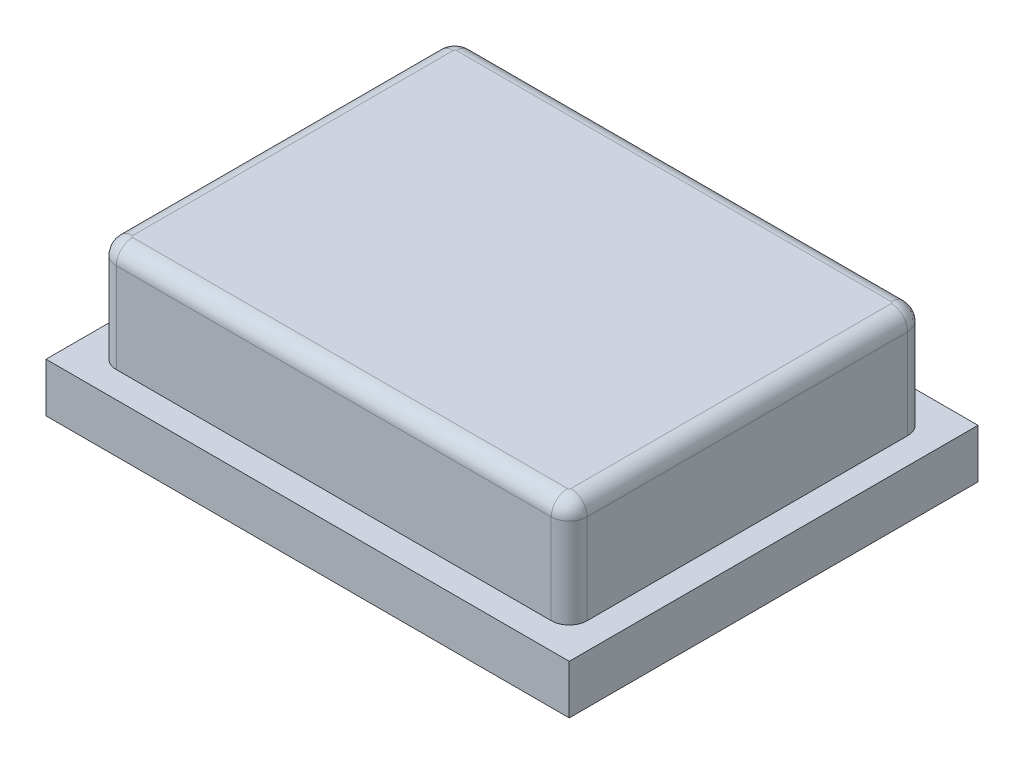
ISO-10303-21;
HEADER;
FILE_DESCRIPTION(('STEP AP214'),'2;1');
FILE_NAME('part.step','',(''),(''),'','','');
FILE_SCHEMA(('AUTOMOTIVE_DESIGN { 1 0 10303 214 1 1 1 1 }'));
ENDSEC;
DATA;
#1=APPLICATION_CONTEXT('core data for automotive mechanical design processes');
#2=APPLICATION_PROTOCOL_DEFINITION('international standard','automotive_design',2000,#1);
#3=PRODUCT_CONTEXT('',#1,'mechanical');
#4=PRODUCT('Part','Part','',(#3));
#5=PRODUCT_RELATED_PRODUCT_CATEGORY('part','',(#4));
#6=PRODUCT_DEFINITION_FORMATION('','',#4);
#7=PRODUCT_DEFINITION_CONTEXT('part definition',#1,'design');
#8=PRODUCT_DEFINITION('design','',#6,#7);
#9=PRODUCT_DEFINITION_SHAPE('','',#8);
#10=(LENGTH_UNIT() NAMED_UNIT(*) SI_UNIT(.MILLI.,.METRE.));
#11=(NAMED_UNIT(*) PLANE_ANGLE_UNIT() SI_UNIT($,.RADIAN.));
#12=(NAMED_UNIT(*) SI_UNIT($,.STERADIAN.) SOLID_ANGLE_UNIT());
#13=UNCERTAINTY_MEASURE_WITH_UNIT(LENGTH_MEASURE(1.E-05),#10,'distance_accuracy_value','');
#14=(GEOMETRIC_REPRESENTATION_CONTEXT(3) GLOBAL_UNCERTAINTY_ASSIGNED_CONTEXT((#13)) GLOBAL_UNIT_ASSIGNED_CONTEXT((#10,
#11,#12)) REPRESENTATION_CONTEXT('',''));
#15=CARTESIAN_POINT('',(0.,0.,0.));
#16=DIRECTION('',(0.,0.,1.));
#17=DIRECTION('',(1.,0.,0.));
#18=AXIS2_PLACEMENT_3D('',#15,#16,#17);
#19=CARTESIAN_POINT('',(-0.95,0.,0.));
#20=DIRECTION('',(0.,-1.,0.));
#21=DIRECTION('',(0.,0.,-1.));
#22=AXIS2_PLACEMENT_3D('',#19,#20,#21);
#23=PLANE('',#22);
#24=DIRECTION('',(0.,0.,-1.));
#25=VECTOR('',#24,1.);
#26=CARTESIAN_POINT('',(-1.55,0.,1.15));
#27=LINE('',#26,#25);
#28=CARTESIAN_POINT('',(-1.55,0.,1.15));
#29=VERTEX_POINT('',#28);
#30=CARTESIAN_POINT('',(-1.55,0.,-1.15));
#31=VERTEX_POINT('',#30);
#32=EDGE_CURVE('P0_E55',#29,#31,#27,.T.);
#33=ORIENTED_EDGE('',*,*,#32,.T.);
#34=DIRECTION('',(1.,0.,0.));
#35=VECTOR('',#34,1.);
#36=CARTESIAN_POINT('',(-1.55,0.,-1.15));
#37=LINE('',#36,#35);
#38=CARTESIAN_POINT('',(-0.35,0.,-1.15));
#39=VERTEX_POINT('',#38);
#40=EDGE_CURVE('P0_E76',#31,#39,#37,.T.);
#41=ORIENTED_EDGE('',*,*,#40,.T.);
#42=DIRECTION('',(0.,0.,1.));
#43=VECTOR('',#42,1.);
#44=CARTESIAN_POINT('',(-0.35,0.,1.15));
#45=LINE('',#44,#43);
#46=CARTESIAN_POINT('',(-0.35,0.,1.15));
#47=VERTEX_POINT('',#46);
#48=EDGE_CURVE('P0_E58',#39,#47,#45,.T.);
#49=ORIENTED_EDGE('',*,*,#48,.T.);
#50=DIRECTION('',(-1.,0.,0.));
#51=VECTOR('',#50,1.);
#52=CARTESIAN_POINT('',(-1.55,0.,1.15));
#53=LINE('',#52,#51);
#54=EDGE_CURVE('P0_E20',#47,#29,#53,.T.);
#55=ORIENTED_EDGE('',*,*,#54,.T.);
#56=EDGE_LOOP('',(#33,#41,#49,#55));
#57=FACE_BOUND('',#56,.T.);
#58=ADVANCED_FACE('P0_F17',(#57),#23,.T.);
#59=CARTESIAN_POINT('',(-1.55,0.05,1.15));
#60=DIRECTION('',(0.,0.,-1.));
#61=DIRECTION('',(-1.,0.,0.));
#62=AXIS2_PLACEMENT_3D('',#59,#60,#61);
#63=PLANE('',#62);
#64=DIRECTION('',(0.,1.,0.));
#65=VECTOR('',#64,1.);
#66=CARTESIAN_POINT('',(-0.35,0.05,1.15));
#67=LINE('',#66,#65);
#68=CARTESIAN_POINT('',(-0.35,0.05,1.15));
#69=VERTEX_POINT('',#68);
#70=EDGE_CURVE('P0_E78',#47,#69,#67,.T.);
#71=ORIENTED_EDGE('',*,*,#70,.T.);
#72=DIRECTION('',(1.,0.,0.));
#73=VECTOR('',#72,1.);
#74=CARTESIAN_POINT('',(-0.95,0.05,1.15));
#75=LINE('',#74,#73);
#76=CARTESIAN_POINT('',(-1.55,0.05,1.15));
#77=VERTEX_POINT('',#76);
#78=EDGE_CURVE('P0_E73',#69,#77,#75,.F.);
#79=ORIENTED_EDGE('',*,*,#78,.T.);
#80=DIRECTION('',(0.,1.,0.));
#81=VECTOR('',#80,1.);
#82=CARTESIAN_POINT('',(-1.55,0.05,1.15));
#83=LINE('',#82,#81);
#84=EDGE_CURVE('P0_E63',#77,#29,#83,.F.);
#85=ORIENTED_EDGE('',*,*,#84,.T.);
#86=ORIENTED_EDGE('',*,*,#54,.F.);
#87=EDGE_LOOP('',(#71,#79,#85,#86));
#88=FACE_BOUND('',#87,.T.);
#89=ADVANCED_FACE('P0_F72',(#88),#63,.F.);
#90=CARTESIAN_POINT('',(-1.55,0.05,1.15));
#91=DIRECTION('',(1.,0.,0.));
#92=DIRECTION('',(0.,0.,-1.));
#93=AXIS2_PLACEMENT_3D('',#90,#91,#92);
#94=PLANE('',#93);
#95=ORIENTED_EDGE('',*,*,#84,.F.);
#96=DIRECTION('',(0.,0.,-1.));
#97=VECTOR('',#96,1.);
#98=CARTESIAN_POINT('',(-1.55,0.05,0.));
#99=LINE('',#98,#97);
#100=CARTESIAN_POINT('',(-1.55,0.05,-1.15));
#101=VERTEX_POINT('',#100);
#102=EDGE_CURVE('P0_E83',#77,#101,#99,.T.);
#103=ORIENTED_EDGE('',*,*,#102,.T.);
#104=DIRECTION('',(0.,1.,0.));
#105=VECTOR('',#104,1.);
#106=CARTESIAN_POINT('',(-1.55,0.05,-1.15));
#107=LINE('',#106,#105);
#108=EDGE_CURVE('P0_E69',#101,#31,#107,.F.);
#109=ORIENTED_EDGE('',*,*,#108,.T.);
#110=ORIENTED_EDGE('',*,*,#32,.F.);
#111=EDGE_LOOP('',(#95,#103,#109,#110));
#112=FACE_BOUND('',#111,.T.);
#113=ADVANCED_FACE('P0_F66',(#112),#94,.F.);
#114=CARTESIAN_POINT('',(-1.55,0.05,-1.15));
#115=DIRECTION('',(0.,0.,1.));
#116=DIRECTION('',(1.,0.,0.));
#117=AXIS2_PLACEMENT_3D('',#114,#115,#116);
#118=PLANE('',#117);
#119=ORIENTED_EDGE('',*,*,#108,.F.);
#120=DIRECTION('',(1.,0.,0.));
#121=VECTOR('',#120,1.);
#122=CARTESIAN_POINT('',(-0.95,0.05,-1.15));
#123=LINE('',#122,#121);
#124=CARTESIAN_POINT('',(-0.35,0.05,-1.15));
#125=VERTEX_POINT('',#124);
#126=EDGE_CURVE('P0_E26',#101,#125,#123,.T.);
#127=ORIENTED_EDGE('',*,*,#126,.T.);
#128=DIRECTION('',(0.,1.,0.));
#129=VECTOR('',#128,1.);
#130=CARTESIAN_POINT('',(-0.35,0.05,-1.15));
#131=LINE('',#130,#129);
#132=EDGE_CURVE('P0_E34',#125,#39,#131,.F.);
#133=ORIENTED_EDGE('',*,*,#132,.T.);
#134=ORIENTED_EDGE('',*,*,#40,.F.);
#135=EDGE_LOOP('',(#119,#127,#133,#134));
#136=FACE_BOUND('',#135,.T.);
#137=ADVANCED_FACE('P0_F88',(#136),#118,.F.);
#138=CARTESIAN_POINT('',(-0.35,0.05,1.15));
#139=DIRECTION('',(-1.,0.,0.));
#140=DIRECTION('',(0.,0.,1.));
#141=AXIS2_PLACEMENT_3D('',#138,#139,#140);
#142=PLANE('',#141);
#143=ORIENTED_EDGE('',*,*,#132,.F.);
#144=DIRECTION('',(0.,0.,-1.));
#145=VECTOR('',#144,1.);
#146=CARTESIAN_POINT('',(-0.35,0.05,0.));
#147=LINE('',#146,#145);
#148=EDGE_CURVE('P0_E11',#125,#69,#147,.F.);
#149=ORIENTED_EDGE('',*,*,#148,.T.);
#150=ORIENTED_EDGE('',*,*,#70,.F.);
#151=ORIENTED_EDGE('',*,*,#48,.F.);
#152=EDGE_LOOP('',(#143,#149,#150,#151));
#153=FACE_BOUND('',#152,.T.);
#154=ADVANCED_FACE('P0_F91',(#153),#142,.F.);
#155=CARTESIAN_POINT('',(-0.95,0.05,0.));
#156=DIRECTION('',(0.,-1.,0.));
#157=DIRECTION('',(0.,0.,-1.));
#158=AXIS2_PLACEMENT_3D('',#155,#156,#157);
#159=PLANE('',#158);
#160=ORIENTED_EDGE('',*,*,#126,.F.);
#161=ORIENTED_EDGE('',*,*,#102,.F.);
#162=ORIENTED_EDGE('',*,*,#78,.F.);
#163=ORIENTED_EDGE('',*,*,#148,.F.);
#164=EDGE_LOOP('',(#160,#161,#162,#163));
#165=FACE_BOUND('',#164,.T.);
#166=ADVANCED_FACE('P0_F90',(#165),#159,.F.);
#167=CLOSED_SHELL('',(#58,#89,#113,#137,#154,#166));
#168=MANIFOLD_SOLID_BREP('P0_B1',#167);
#169=CARTESIAN_POINT('',(0.,1.,0.));
#170=DIRECTION('',(0.,-1.,0.));
#171=DIRECTION('',(0.,0.,-1.));
#172=AXIS2_PLACEMENT_3D('',#169,#170,#171);
#173=PLANE('',#172);
#174=CARTESIAN_POINT('',(1.33,1.,0.98));
#175=DIRECTION('',(0.,-1.,0.));
#176=DIRECTION('',(1.,0.,0.));
#177=AXIS2_PLACEMENT_3D('',#174,#175,#176);
#178=CIRCLE('',#177,0.01);
#179=CARTESIAN_POINT('',(1.34,1.,0.98));
#180=VERTEX_POINT('',#179);
#181=CARTESIAN_POINT('',(1.33,1.,0.99));
#182=VERTEX_POINT('',#181);
#183=EDGE_CURVE('P1_E278',#180,#182,#178,.T.);
#184=ORIENTED_EDGE('',*,*,#183,.F.);
#185=DIRECTION('',(0.,0.,-1.));
#186=VECTOR('',#185,1.);
#187=CARTESIAN_POINT('',(1.34,1.,0.));
#188=LINE('',#187,#186);
#189=CARTESIAN_POINT('',(1.34,1.,-0.98));
#190=VERTEX_POINT('',#189);
#191=EDGE_CURVE('P1_E244',#190,#180,#188,.F.);
#192=ORIENTED_EDGE('',*,*,#191,.F.);
#193=CARTESIAN_POINT('',(1.33,1.,-0.98));
#194=DIRECTION('',(0.,-1.,0.));
#195=DIRECTION('',(0.,0.,-1.));
#196=AXIS2_PLACEMENT_3D('',#193,#194,#195);
#197=CIRCLE('',#196,0.01);
#198=CARTESIAN_POINT('',(1.33,1.,-0.99));
#199=VERTEX_POINT('',#198);
#200=EDGE_CURVE('P1_E410',#199,#190,#197,.T.);
#201=ORIENTED_EDGE('',*,*,#200,.F.);
#202=DIRECTION('',(-1.,0.,0.));
#203=VECTOR('',#202,1.);
#204=CARTESIAN_POINT('',(0.,1.,-0.99));
#205=LINE('',#204,#203);
#206=CARTESIAN_POINT('',(-1.33,1.,-0.99));
#207=VERTEX_POINT('',#206);
#208=EDGE_CURVE('P1_E211',#207,#199,#205,.F.);
#209=ORIENTED_EDGE('',*,*,#208,.F.);
#210=CARTESIAN_POINT('',(-1.33,1.,-0.98));
#211=DIRECTION('',(0.,-1.,0.));
#212=DIRECTION('',(-1.,0.,0.));
#213=AXIS2_PLACEMENT_3D('',#210,#211,#212);
#214=CIRCLE('',#213,0.01);
#215=CARTESIAN_POINT('',(-1.34,1.,-0.98));
#216=VERTEX_POINT('',#215);
#217=EDGE_CURVE('P1_E207',#216,#207,#214,.T.);
#218=ORIENTED_EDGE('',*,*,#217,.F.);
#219=DIRECTION('',(0.,0.,1.));
#220=VECTOR('',#219,1.);
#221=CARTESIAN_POINT('',(-1.34,1.,0.));
#222=LINE('',#221,#220);
#223=CARTESIAN_POINT('',(-1.34,1.,0.98));
#224=VERTEX_POINT('',#223);
#225=EDGE_CURVE('P1_E151',#224,#216,#222,.F.);
#226=ORIENTED_EDGE('',*,*,#225,.F.);
#227=CARTESIAN_POINT('',(-1.33,1.,0.98));
#228=DIRECTION('',(0.,-1.,0.));
#229=DIRECTION('',(0.,0.,1.));
#230=AXIS2_PLACEMENT_3D('',#227,#228,#229);
#231=CIRCLE('',#230,0.01);
#232=CARTESIAN_POINT('',(-1.33,1.,0.99));
#233=VERTEX_POINT('',#232);
#234=EDGE_CURVE('P1_E149',#233,#224,#231,.T.);
#235=ORIENTED_EDGE('',*,*,#234,.F.);
#236=DIRECTION('',(1.,0.,0.));
#237=VECTOR('',#236,1.);
#238=CARTESIAN_POINT('',(0.,1.,0.99));
#239=LINE('',#238,#237);
#240=EDGE_CURVE('P1_E279',#182,#233,#239,.F.);
#241=ORIENTED_EDGE('',*,*,#240,.F.);
#242=EDGE_LOOP('',(#184,#192,#201,#209,#218,#226,#235,#241));
#243=FACE_BOUND('',#242,.T.);
#244=ADVANCED_FACE('P1_F17',(#243),#173,.F.);
#245=CARTESIAN_POINT('',(1.33,1.,-0.99));
#246=CARTESIAN_POINT('',(1.33,1.,-1.01617993878));
#247=CARTESIAN_POINT('',(1.33,0.991777231398,-1.042357650071));
#248=CARTESIAN_POINT('',(1.33,0.975319014964,-1.065319014964));
#249=CARTESIAN_POINT('',(1.33,0.952357650071,-1.081777231398));
#250=CARTESIAN_POINT('',(1.33,0.92617993878,-1.09));
#251=CARTESIAN_POINT('',(1.33,0.9,-1.09));
#252=(BOUNDED_CURVE() B_SPLINE_CURVE(6,(#245,#246,#247,#248,#249,#250,#251),.UNSPECIFIED.,.F.,
.F.) B_SPLINE_CURVE_WITH_KNOTS((7,7),(4.712388980385,6.28318530718),
.UNSPECIFIED.) CURVE() GEOMETRIC_REPRESENTATION_ITEM() RATIONAL_B_SPLINE_CURVE((1.,1.,1.,1.,1.,
1.,1.)) REPRESENTATION_ITEM(''));
#253=CARTESIAN_POINT('',(1.33,0.9,-0.98));
#254=DIRECTION('',(0.,1.,0.));
#255=AXIS1_PLACEMENT('',#253,#254);
#256=SURFACE_OF_REVOLUTION('',#252,#255);
#257=CARTESIAN_POINT('',(1.34,0.9,-0.98));
#258=DIRECTION('',(0.,0.,-1.));
#259=DIRECTION('',(-1.,0.,0.));
#260=AXIS2_PLACEMENT_3D('',#257,#258,#259);
#261=CIRCLE('',#260,0.1);
#262=CARTESIAN_POINT('',(1.44,0.9,-0.98));
#263=VERTEX_POINT('',#262);
#264=EDGE_CURVE('P1_E327',#263,#190,#261,.F.);
#265=ORIENTED_EDGE('',*,*,#264,.F.);
#266=CARTESIAN_POINT('',(1.33,0.9,-0.98));
#267=DIRECTION('',(0.,-1.,0.));
#268=DIRECTION('',(0.,0.,-1.));
#269=AXIS2_PLACEMENT_3D('',#266,#267,#268);
#270=CIRCLE('',#269,0.11);
#271=CARTESIAN_POINT('',(1.33,0.9,-1.09));
#272=VERTEX_POINT('',#271);
#273=EDGE_CURVE('P1_E309',#272,#263,#270,.T.);
#274=ORIENTED_EDGE('',*,*,#273,.F.);
#275=CARTESIAN_POINT('',(1.33,0.9,-0.99));
#276=DIRECTION('',(-1.,0.,0.));
#277=DIRECTION('',(0.,0.,1.));
#278=AXIS2_PLACEMENT_3D('',#275,#276,#277);
#279=CIRCLE('',#278,0.1);
#280=EDGE_CURVE('P1_E231',#199,#272,#279,.T.);
#281=ORIENTED_EDGE('',*,*,#280,.F.);
#282=ORIENTED_EDGE('',*,*,#200,.T.);
#283=EDGE_LOOP('',(#265,#274,#281,#282));
#284=FACE_BOUND('',#283,.T.);
#285=ADVANCED_FACE('P1_F249',(#284),#256,.F.);
#286=CARTESIAN_POINT('',(0.,0.9,-0.99));
#287=DIRECTION('',(-1.,0.,0.));
#288=DIRECTION('',(0.,0.,1.));
#289=AXIS2_PLACEMENT_3D('',#286,#287,#288);
#290=CYLINDRICAL_SURFACE('',#289,0.1);
#291=ORIENTED_EDGE('',*,*,#280,.T.);
#292=DIRECTION('',(1.,0.,0.));
#293=VECTOR('',#292,1.);
#294=CARTESIAN_POINT('',(-1.44,0.9,-1.09));
#295=LINE('',#294,#293);
#296=CARTESIAN_POINT('',(-1.33,0.9,-1.09));
#297=VERTEX_POINT('',#296);
#298=EDGE_CURVE('P1_E297',#272,#297,#295,.F.);
#299=ORIENTED_EDGE('',*,*,#298,.T.);
#300=CARTESIAN_POINT('',(-1.33,0.9,-0.99));
#301=DIRECTION('',(-1.,0.,0.));
#302=DIRECTION('',(0.,0.,1.));
#303=AXIS2_PLACEMENT_3D('',#300,#301,#302);
#304=CIRCLE('',#303,0.1);
#305=EDGE_CURVE('P1_E237',#207,#297,#304,.T.);
#306=ORIENTED_EDGE('',*,*,#305,.F.);
#307=ORIENTED_EDGE('',*,*,#208,.T.);
#308=EDGE_LOOP('',(#291,#299,#306,#307));
#309=FACE_BOUND('',#308,.T.);
#310=ADVANCED_FACE('P1_F223',(#309),#290,.T.);
#311=CARTESIAN_POINT('',(-1.33,1.,-0.99));
#312=CARTESIAN_POINT('',(-1.33,1.,-1.01617993878));
#313=CARTESIAN_POINT('',(-1.33,0.991777231398,-1.042357650071));
#314=CARTESIAN_POINT('',(-1.33,0.975319014964,-1.065319014964));
#315=CARTESIAN_POINT('',(-1.33,0.952357650071,-1.081777231398));
#316=CARTESIAN_POINT('',(-1.33,0.92617993878,-1.09));
#317=CARTESIAN_POINT('',(-1.33,0.9,-1.09));
#318=(BOUNDED_CURVE() B_SPLINE_CURVE(6,(#311,#312,#313,#314,#315,#316,#317),.UNSPECIFIED.,.F.,
.F.) B_SPLINE_CURVE_WITH_KNOTS((7,7),(4.712388980385,6.28318530718),
.UNSPECIFIED.) CURVE() GEOMETRIC_REPRESENTATION_ITEM() RATIONAL_B_SPLINE_CURVE((1.,1.,1.,1.,1.,
1.,1.)) REPRESENTATION_ITEM(''));
#319=CARTESIAN_POINT('',(-1.33,0.9,-0.98));
#320=DIRECTION('',(0.,1.,0.));
#321=AXIS1_PLACEMENT('',#319,#320);
#322=SURFACE_OF_REVOLUTION('',#318,#321);
#323=CARTESIAN_POINT('',(-1.34,0.9,-0.98));
#324=DIRECTION('',(0.,0.,1.));
#325=DIRECTION('',(1.,0.,0.));
#326=AXIS2_PLACEMENT_3D('',#323,#324,#325);
#327=CIRCLE('',#326,0.1);
#328=CARTESIAN_POINT('',(-1.44,0.9,-0.98));
#329=VERTEX_POINT('',#328);
#330=EDGE_CURVE('P1_E137',#216,#329,#327,.T.);
#331=ORIENTED_EDGE('',*,*,#330,.F.);
#332=ORIENTED_EDGE('',*,*,#217,.T.);
#333=ORIENTED_EDGE('',*,*,#305,.T.);
#334=CARTESIAN_POINT('',(-1.33,0.9,-0.98));
#335=DIRECTION('',(0.,-1.,0.));
#336=DIRECTION('',(0.,0.,-1.));
#337=AXIS2_PLACEMENT_3D('',#334,#335,#336);
#338=CIRCLE('',#337,0.11);
#339=EDGE_CURVE('P1_E286',#329,#297,#338,.T.);
#340=ORIENTED_EDGE('',*,*,#339,.F.);
#341=EDGE_LOOP('',(#331,#332,#333,#340));
#342=FACE_BOUND('',#341,.T.);
#343=ADVANCED_FACE('P1_F213',(#342),#322,.F.);
#344=CARTESIAN_POINT('',(-1.34,0.9,0.));
#345=DIRECTION('',(0.,0.,1.));
#346=DIRECTION('',(1.,0.,0.));
#347=AXIS2_PLACEMENT_3D('',#344,#345,#346);
#348=CYLINDRICAL_SURFACE('',#347,0.1);
#349=CARTESIAN_POINT('',(-1.34,0.9,0.98));
#350=DIRECTION('',(0.,0.,1.));
#351=DIRECTION('',(1.,0.,0.));
#352=AXIS2_PLACEMENT_3D('',#349,#350,#351);
#353=CIRCLE('',#352,0.1);
#354=CARTESIAN_POINT('',(-1.44,0.9,0.98));
#355=VERTEX_POINT('',#354);
#356=EDGE_CURVE('P1_E134',#224,#355,#353,.T.);
#357=ORIENTED_EDGE('',*,*,#356,.F.);
#358=ORIENTED_EDGE('',*,*,#225,.T.);
#359=ORIENTED_EDGE('',*,*,#330,.T.);
#360=DIRECTION('',(0.,0.,-1.));
#361=VECTOR('',#360,1.);
#362=CARTESIAN_POINT('',(-1.44,0.9,1.09));
#363=LINE('',#362,#361);
#364=EDGE_CURVE('P1_E130',#329,#355,#363,.F.);
#365=ORIENTED_EDGE('',*,*,#364,.T.);
#366=EDGE_LOOP('',(#357,#358,#359,#365));
#367=FACE_BOUND('',#366,.T.);
#368=ADVANCED_FACE('P1_F132',(#367),#348,.T.);
#369=CARTESIAN_POINT('',(-1.33,1.,0.97));
#370=CARTESIAN_POINT('',(-1.33,1.,0.94382006122));
#371=CARTESIAN_POINT('',(-1.33,0.991777231398,0.917642349929));
#372=CARTESIAN_POINT('',(-1.33,0.975319014964,0.894680985036));
#373=CARTESIAN_POINT('',(-1.33,0.952357650071,0.878222768602));
#374=CARTESIAN_POINT('',(-1.33,0.92617993878,0.87));
#375=CARTESIAN_POINT('',(-1.33,0.9,0.87));
#376=(BOUNDED_CURVE() B_SPLINE_CURVE(6,(#369,#370,#371,#372,#373,#374,#375),.UNSPECIFIED.,.F.,
.F.) B_SPLINE_CURVE_WITH_KNOTS((7,7),(4.712388980385,6.28318530718),
.UNSPECIFIED.) CURVE() GEOMETRIC_REPRESENTATION_ITEM() RATIONAL_B_SPLINE_CURVE((1.,1.,1.,1.,1.,
1.,1.)) REPRESENTATION_ITEM(''));
#377=CARTESIAN_POINT('',(-1.33,0.9,0.98));
#378=DIRECTION('',(0.,1.,0.));
#379=AXIS1_PLACEMENT('',#377,#378);
#380=SURFACE_OF_REVOLUTION('',#376,#379);
#381=CARTESIAN_POINT('',(-1.33,0.9,0.99));
#382=DIRECTION('',(1.,0.,0.));
#383=DIRECTION('',(0.,0.,-1.));
#384=AXIS2_PLACEMENT_3D('',#381,#382,#383);
#385=CIRCLE('',#384,0.1);
#386=CARTESIAN_POINT('',(-1.33,0.9,1.09));
#387=VERTEX_POINT('',#386);
#388=EDGE_CURVE('P1_E349',#233,#387,#385,.T.);
#389=ORIENTED_EDGE('',*,*,#388,.F.);
#390=ORIENTED_EDGE('',*,*,#234,.T.);
#391=ORIENTED_EDGE('',*,*,#356,.T.);
#392=CARTESIAN_POINT('',(-1.33,0.9,0.98));
#393=DIRECTION('',(0.,-1.,0.));
#394=DIRECTION('',(0.,0.,-1.));
#395=AXIS2_PLACEMENT_3D('',#392,#393,#394);
#396=CIRCLE('',#395,0.11);
#397=EDGE_CURVE('P1_E141',#387,#355,#396,.T.);
#398=ORIENTED_EDGE('',*,*,#397,.F.);
#399=EDGE_LOOP('',(#389,#390,#391,#398));
#400=FACE_BOUND('',#399,.T.);
#401=ADVANCED_FACE('P1_F146',(#400),#380,.F.);
#402=CARTESIAN_POINT('',(0.,0.9,0.99));
#403=DIRECTION('',(1.,0.,0.));
#404=DIRECTION('',(0.,0.,-1.));
#405=AXIS2_PLACEMENT_3D('',#402,#403,#404);
#406=CYLINDRICAL_SURFACE('',#405,0.1);
#407=CARTESIAN_POINT('',(1.33,0.9,0.99));
#408=DIRECTION('',(1.,0.,0.));
#409=DIRECTION('',(0.,0.,-1.));
#410=AXIS2_PLACEMENT_3D('',#407,#408,#409);
#411=CIRCLE('',#410,0.1);
#412=CARTESIAN_POINT('',(1.33,0.9,1.09));
#413=VERTEX_POINT('',#412);
#414=EDGE_CURVE('P1_E275',#182,#413,#411,.T.);
#415=ORIENTED_EDGE('',*,*,#414,.F.);
#416=ORIENTED_EDGE('',*,*,#240,.T.);
#417=ORIENTED_EDGE('',*,*,#388,.T.);
#418=DIRECTION('',(-1.,0.,0.));
#419=VECTOR('',#418,1.);
#420=CARTESIAN_POINT('',(-1.44,0.9,1.09));
#421=LINE('',#420,#419);
#422=EDGE_CURVE('P1_E340',#387,#413,#421,.F.);
#423=ORIENTED_EDGE('',*,*,#422,.T.);
#424=EDGE_LOOP('',(#415,#416,#417,#423));
#425=FACE_BOUND('',#424,.T.);
#426=ADVANCED_FACE('P1_F187',(#425),#406,.T.);
#427=CARTESIAN_POINT('',(1.33,1.,0.97));
#428=CARTESIAN_POINT('',(1.33,1.,0.94382006122));
#429=CARTESIAN_POINT('',(1.33,0.991777231398,0.917642349929));
#430=CARTESIAN_POINT('',(1.33,0.975319014964,0.894680985036));
#431=CARTESIAN_POINT('',(1.33,0.952357650071,0.878222768602));
#432=CARTESIAN_POINT('',(1.33,0.92617993878,0.87));
#433=CARTESIAN_POINT('',(1.33,0.9,0.87));
#434=(BOUNDED_CURVE() B_SPLINE_CURVE(6,(#427,#428,#429,#430,#431,#432,#433),.UNSPECIFIED.,.F.,
.F.) B_SPLINE_CURVE_WITH_KNOTS((7,7),(4.712388980385,6.28318530718),
.UNSPECIFIED.) CURVE() GEOMETRIC_REPRESENTATION_ITEM() RATIONAL_B_SPLINE_CURVE((1.,1.,1.,1.,1.,
1.,1.)) REPRESENTATION_ITEM(''));
#435=CARTESIAN_POINT('',(1.33,0.9,0.98));
#436=DIRECTION('',(0.,1.,0.));
#437=AXIS1_PLACEMENT('',#435,#436);
#438=SURFACE_OF_REVOLUTION('',#434,#437);
#439=CARTESIAN_POINT('',(1.34,0.9,0.98));
#440=DIRECTION('',(0.,0.,-1.));
#441=DIRECTION('',(-1.,0.,0.));
#442=AXIS2_PLACEMENT_3D('',#439,#440,#441);
#443=CIRCLE('',#442,0.1);
#444=CARTESIAN_POINT('',(1.44,0.9,0.98));
#445=VERTEX_POINT('',#444);
#446=EDGE_CURVE('P1_E313',#180,#445,#443,.T.);
#447=ORIENTED_EDGE('',*,*,#446,.F.);
#448=ORIENTED_EDGE('',*,*,#183,.T.);
#449=ORIENTED_EDGE('',*,*,#414,.T.);
#450=CARTESIAN_POINT('',(1.33,0.9,0.98));
#451=DIRECTION('',(0.,-1.,0.));
#452=DIRECTION('',(0.,0.,-1.));
#453=AXIS2_PLACEMENT_3D('',#450,#451,#452);
#454=CIRCLE('',#453,0.11);
#455=EDGE_CURVE('P1_E336',#445,#413,#454,.T.);
#456=ORIENTED_EDGE('',*,*,#455,.F.);
#457=EDGE_LOOP('',(#447,#448,#449,#456));
#458=FACE_BOUND('',#457,.T.);
#459=ADVANCED_FACE('P1_F353',(#458),#438,.F.);
#460=CARTESIAN_POINT('',(1.34,0.9,0.));
#461=DIRECTION('',(0.,0.,-1.));
#462=DIRECTION('',(-1.,0.,0.));
#463=AXIS2_PLACEMENT_3D('',#460,#461,#462);
#464=CYLINDRICAL_SURFACE('',#463,0.1);
#465=ORIENTED_EDGE('',*,*,#446,.T.);
#466=DIRECTION('',(0.,0.,1.));
#467=VECTOR('',#466,1.);
#468=CARTESIAN_POINT('',(1.44,0.9,1.09));
#469=LINE('',#468,#467);
#470=EDGE_CURVE('P1_E321',#445,#263,#469,.F.);
#471=ORIENTED_EDGE('',*,*,#470,.T.);
#472=ORIENTED_EDGE('',*,*,#264,.T.);
#473=ORIENTED_EDGE('',*,*,#191,.T.);
#474=EDGE_LOOP('',(#465,#471,#472,#473));
#475=FACE_BOUND('',#474,.T.);
#476=ADVANCED_FACE('P1_F357',(#475),#464,.T.);
#477=CARTESIAN_POINT('',(1.33,1.,-0.98));
#478=DIRECTION('',(0.,-1.,0.));
#479=DIRECTION('',(0.,0.,-1.));
#480=AXIS2_PLACEMENT_3D('',#477,#478,#479);
#481=CYLINDRICAL_SURFACE('',#480,0.11);
#482=DIRECTION('',(0.,1.,0.));
#483=VECTOR('',#482,1.);
#484=CARTESIAN_POINT('',(1.44,1.,-0.98));
#485=LINE('',#484,#483);
#486=CARTESIAN_POINT('',(1.44,0.35,-0.98));
#487=VERTEX_POINT('',#486);
#488=EDGE_CURVE('P1_E274',#263,#487,#485,.F.);
#489=ORIENTED_EDGE('',*,*,#488,.T.);
#490=CARTESIAN_POINT('',(1.33,0.35,-0.98));
#491=DIRECTION('',(0.,-1.,0.));
#492=DIRECTION('',(0.,0.,-1.));
#493=AXIS2_PLACEMENT_3D('',#490,#491,#492);
#494=CIRCLE('',#493,0.11);
#495=CARTESIAN_POINT('',(1.33,0.35,-1.09));
#496=VERTEX_POINT('',#495);
#497=EDGE_CURVE('P1_E272',#487,#496,#494,.F.);
#498=ORIENTED_EDGE('',*,*,#497,.T.);
#499=DIRECTION('',(0.,1.,0.));
#500=VECTOR('',#499,1.);
#501=CARTESIAN_POINT('',(1.33,1.,-1.09));
#502=LINE('',#501,#500);
#503=EDGE_CURVE('P1_E304',#496,#272,#502,.T.);
#504=ORIENTED_EDGE('',*,*,#503,.T.);
#505=ORIENTED_EDGE('',*,*,#273,.T.);
#506=EDGE_LOOP('',(#489,#498,#504,#505));
#507=FACE_BOUND('',#506,.T.);
#508=ADVANCED_FACE('P1_F476',(#507),#481,.T.);
#509=CARTESIAN_POINT('',(-1.44,1.,-1.09));
#510=DIRECTION('',(0.,0.,1.));
#511=DIRECTION('',(1.,0.,0.));
#512=AXIS2_PLACEMENT_3D('',#509,#510,#511);
#513=PLANE('',#512);
#514=ORIENTED_EDGE('',*,*,#298,.F.);
#515=ORIENTED_EDGE('',*,*,#503,.F.);
#516=DIRECTION('',(1.,0.,0.));
#517=VECTOR('',#516,1.);
#518=CARTESIAN_POINT('',(0.,0.35,-1.09));
#519=LINE('',#518,#517);
#520=CARTESIAN_POINT('',(-1.33,0.35,-1.09));
#521=VERTEX_POINT('',#520);
#522=EDGE_CURVE('P1_E271',#496,#521,#519,.F.);
#523=ORIENTED_EDGE('',*,*,#522,.T.);
#524=DIRECTION('',(0.,-1.,0.));
#525=VECTOR('',#524,1.);
#526=CARTESIAN_POINT('',(-1.33,1.,-1.09));
#527=LINE('',#526,#525);
#528=EDGE_CURVE('P1_E294',#297,#521,#527,.T.);
#529=ORIENTED_EDGE('',*,*,#528,.F.);
#530=EDGE_LOOP('',(#514,#515,#523,#529));
#531=FACE_BOUND('',#530,.T.);
#532=ADVANCED_FACE('P1_F295',(#531),#513,.F.);
#533=CARTESIAN_POINT('',(-1.33,1.,-0.98));
#534=DIRECTION('',(0.,-1.,0.));
#535=DIRECTION('',(0.,0.,-1.));
#536=AXIS2_PLACEMENT_3D('',#533,#534,#535);
#537=CYLINDRICAL_SURFACE('',#536,0.11);
#538=ORIENTED_EDGE('',*,*,#528,.T.);
#539=CARTESIAN_POINT('',(-1.33,0.35,-0.98));
#540=DIRECTION('',(0.,-1.,0.));
#541=DIRECTION('',(0.,0.,-1.));
#542=AXIS2_PLACEMENT_3D('',#539,#540,#541);
#543=CIRCLE('',#542,0.11);
#544=CARTESIAN_POINT('',(-1.44,0.35,-0.98));
#545=VERTEX_POINT('',#544);
#546=EDGE_CURVE('P1_E269',#521,#545,#543,.F.);
#547=ORIENTED_EDGE('',*,*,#546,.T.);
#548=DIRECTION('',(0.,1.,0.));
#549=VECTOR('',#548,1.);
#550=CARTESIAN_POINT('',(-1.44,1.,-0.98));
#551=LINE('',#550,#549);
#552=EDGE_CURVE('P1_E142',#545,#329,#551,.T.);
#553=ORIENTED_EDGE('',*,*,#552,.T.);
#554=ORIENTED_EDGE('',*,*,#339,.T.);
#555=EDGE_LOOP('',(#538,#547,#553,#554));
#556=FACE_BOUND('',#555,.T.);
#557=ADVANCED_FACE('P1_F302',(#556),#537,.T.);
#558=CARTESIAN_POINT('',(-1.44,1.,1.09));
#559=DIRECTION('',(1.,0.,0.));
#560=DIRECTION('',(0.,0.,-1.));
#561=AXIS2_PLACEMENT_3D('',#558,#559,#560);
#562=PLANE('',#561);
#563=ORIENTED_EDGE('',*,*,#364,.F.);
#564=ORIENTED_EDGE('',*,*,#552,.F.);
#565=DIRECTION('',(0.,0.,-1.));
#566=VECTOR('',#565,1.);
#567=CARTESIAN_POINT('',(-1.44,0.35,0.));
#568=LINE('',#567,#566);
#569=CARTESIAN_POINT('',(-1.44,0.35,0.98));
#570=VERTEX_POINT('',#569);
#571=EDGE_CURVE('P1_E157',#545,#570,#568,.F.);
#572=ORIENTED_EDGE('',*,*,#571,.T.);
#573=DIRECTION('',(0.,-1.,0.));
#574=VECTOR('',#573,1.);
#575=CARTESIAN_POINT('',(-1.44,1.,0.98));
#576=LINE('',#575,#574);
#577=EDGE_CURVE('P1_E154',#355,#570,#576,.T.);
#578=ORIENTED_EDGE('',*,*,#577,.F.);
#579=EDGE_LOOP('',(#563,#564,#572,#578));
#580=FACE_BOUND('',#579,.T.);
#581=ADVANCED_FACE('P1_F155',(#580),#562,.F.);
#582=CARTESIAN_POINT('',(-1.33,1.,0.98));
#583=DIRECTION('',(0.,-1.,0.));
#584=DIRECTION('',(0.,0.,-1.));
#585=AXIS2_PLACEMENT_3D('',#582,#583,#584);
#586=CYLINDRICAL_SURFACE('',#585,0.11);
#587=ORIENTED_EDGE('',*,*,#577,.T.);
#588=CARTESIAN_POINT('',(-1.33,0.35,0.98));
#589=DIRECTION('',(0.,-1.,0.));
#590=DIRECTION('',(0.,0.,-1.));
#591=AXIS2_PLACEMENT_3D('',#588,#589,#590);
#592=CIRCLE('',#591,0.11);
#593=CARTESIAN_POINT('',(-1.33,0.35,1.09));
#594=VERTEX_POINT('',#593);
#595=EDGE_CURVE('P1_E267',#570,#594,#592,.F.);
#596=ORIENTED_EDGE('',*,*,#595,.T.);
#597=DIRECTION('',(0.,1.,0.));
#598=VECTOR('',#597,1.);
#599=CARTESIAN_POINT('',(-1.33,1.,1.09));
#600=LINE('',#599,#598);
#601=EDGE_CURVE('P1_E160',#594,#387,#600,.T.);
#602=ORIENTED_EDGE('',*,*,#601,.T.);
#603=ORIENTED_EDGE('',*,*,#397,.T.);
#604=EDGE_LOOP('',(#587,#596,#602,#603));
#605=FACE_BOUND('',#604,.T.);
#606=ADVANCED_FACE('P1_F162',(#605),#586,.T.);
#607=CARTESIAN_POINT('',(-1.44,1.,1.09));
#608=DIRECTION('',(0.,0.,-1.));
#609=DIRECTION('',(-1.,0.,0.));
#610=AXIS2_PLACEMENT_3D('',#607,#608,#609);
#611=PLANE('',#610);
#612=ORIENTED_EDGE('',*,*,#422,.F.);
#613=ORIENTED_EDGE('',*,*,#601,.F.);
#614=DIRECTION('',(1.,0.,0.));
#615=VECTOR('',#614,1.);
#616=CARTESIAN_POINT('',(0.,0.35,1.09));
#617=LINE('',#616,#615);
#618=CARTESIAN_POINT('',(1.33,0.35,1.09));
#619=VERTEX_POINT('',#618);
#620=EDGE_CURVE('P1_E266',#594,#619,#617,.T.);
#621=ORIENTED_EDGE('',*,*,#620,.T.);
#622=DIRECTION('',(0.,-1.,0.));
#623=VECTOR('',#622,1.);
#624=CARTESIAN_POINT('',(1.33,1.,1.09));
#625=LINE('',#624,#623);
#626=EDGE_CURVE('P1_E339',#413,#619,#625,.T.);
#627=ORIENTED_EDGE('',*,*,#626,.F.);
#628=EDGE_LOOP('',(#612,#613,#621,#627));
#629=FACE_BOUND('',#628,.T.);
#630=ADVANCED_FACE('P1_F379',(#629),#611,.F.);
#631=CARTESIAN_POINT('',(1.33,1.,0.98));
#632=DIRECTION('',(0.,-1.,0.));
#633=DIRECTION('',(0.,0.,-1.));
#634=AXIS2_PLACEMENT_3D('',#631,#632,#633);
#635=CYLINDRICAL_SURFACE('',#634,0.11);
#636=ORIENTED_EDGE('',*,*,#626,.T.);
#637=CARTESIAN_POINT('',(1.33,0.35,0.98));
#638=DIRECTION('',(0.,-1.,0.));
#639=DIRECTION('',(0.,0.,-1.));
#640=AXIS2_PLACEMENT_3D('',#637,#638,#639);
#641=CIRCLE('',#640,0.11);
#642=CARTESIAN_POINT('',(1.44,0.35,0.98));
#643=VERTEX_POINT('',#642);
#644=EDGE_CURVE('P1_E258',#619,#643,#641,.F.);
#645=ORIENTED_EDGE('',*,*,#644,.T.);
#646=DIRECTION('',(0.,1.,0.));
#647=VECTOR('',#646,1.);
#648=CARTESIAN_POINT('',(1.44,1.,0.98));
#649=LINE('',#648,#647);
#650=EDGE_CURVE('P1_E324',#643,#445,#649,.T.);
#651=ORIENTED_EDGE('',*,*,#650,.T.);
#652=ORIENTED_EDGE('',*,*,#455,.T.);
#653=EDGE_LOOP('',(#636,#645,#651,#652));
#654=FACE_BOUND('',#653,.T.);
#655=ADVANCED_FACE('P1_F386',(#654),#635,.T.);
#656=CARTESIAN_POINT('',(1.44,1.,1.09));
#657=DIRECTION('',(-1.,0.,0.));
#658=DIRECTION('',(0.,0.,1.));
#659=AXIS2_PLACEMENT_3D('',#656,#657,#658);
#660=PLANE('',#659);
#661=ORIENTED_EDGE('',*,*,#470,.F.);
#662=ORIENTED_EDGE('',*,*,#650,.F.);
#663=DIRECTION('',(0.,0.,-1.));
#664=VECTOR('',#663,1.);
#665=CARTESIAN_POINT('',(1.44,0.35,0.));
#666=LINE('',#665,#664);
#667=EDGE_CURVE('P1_E265',#643,#487,#666,.T.);
#668=ORIENTED_EDGE('',*,*,#667,.T.);
#669=ORIENTED_EDGE('',*,*,#488,.F.);
#670=EDGE_LOOP('',(#661,#662,#668,#669));
#671=FACE_BOUND('',#670,.T.);
#672=ADVANCED_FACE('P1_F460',(#671),#660,.F.);
#673=CARTESIAN_POINT('',(0.,0.35,0.));
#674=DIRECTION('',(0.,-1.,0.));
#675=DIRECTION('',(0.,0.,-1.));
#676=AXIS2_PLACEMENT_3D('',#673,#674,#675);
#677=PLANE('',#676);
#678=ORIENTED_EDGE('',*,*,#644,.F.);
#679=ORIENTED_EDGE('',*,*,#620,.F.);
#680=ORIENTED_EDGE('',*,*,#595,.F.);
#681=ORIENTED_EDGE('',*,*,#571,.F.);
#682=ORIENTED_EDGE('',*,*,#546,.F.);
#683=ORIENTED_EDGE('',*,*,#522,.F.);
#684=ORIENTED_EDGE('',*,*,#497,.F.);
#685=ORIENTED_EDGE('',*,*,#667,.F.);
#686=EDGE_LOOP('',(#678,#679,#680,#681,#682,#683,#684,#685));
#687=FACE_BOUND('',#686,.T.);
#688=DIRECTION('',(1.,0.,0.));
#689=VECTOR('',#688,1.);
#690=CARTESIAN_POINT('',(-1.6,0.35,-1.25));
#691=LINE('',#690,#689);
#692=CARTESIAN_POINT('',(1.6,0.35,-1.25));
#693=VERTEX_POINT('',#692);
#694=CARTESIAN_POINT('',(-1.6,0.35,-1.25));
#695=VERTEX_POINT('',#694);
#696=EDGE_CURVE('P1_E517',#693,#695,#691,.F.);
#697=ORIENTED_EDGE('',*,*,#696,.T.);
#698=DIRECTION('',(0.,0.,-1.));
#699=VECTOR('',#698,1.);
#700=CARTESIAN_POINT('',(-1.6,0.35,1.25));
#701=LINE('',#700,#699);
#702=CARTESIAN_POINT('',(-1.6,0.35,1.25));
#703=VERTEX_POINT('',#702);
#704=EDGE_CURVE('P1_E510',#695,#703,#701,.F.);
#705=ORIENTED_EDGE('',*,*,#704,.T.);
#706=DIRECTION('',(-1.,0.,0.));
#707=VECTOR('',#706,1.);
#708=CARTESIAN_POINT('',(-1.6,0.35,1.25));
#709=LINE('',#708,#707);
#710=CARTESIAN_POINT('',(1.6,0.35,1.25));
#711=VERTEX_POINT('',#710);
#712=EDGE_CURVE('P1_E506',#703,#711,#709,.F.);
#713=ORIENTED_EDGE('',*,*,#712,.T.);
#714=DIRECTION('',(0.,0.,1.));
#715=VECTOR('',#714,1.);
#716=CARTESIAN_POINT('',(1.6,0.35,1.25));
#717=LINE('',#716,#715);
#718=EDGE_CURVE('P1_E488',#711,#693,#717,.F.);
#719=ORIENTED_EDGE('',*,*,#718,.T.);
#720=EDGE_LOOP('',(#697,#705,#713,#719));
#721=FACE_BOUND('',#720,.T.);
#722=ADVANCED_FACE('P1_F456',(#687,#721),#677,.F.);
#723=CARTESIAN_POINT('',(1.6,0.35,1.25));
#724=DIRECTION('',(-1.,0.,0.));
#725=DIRECTION('',(0.,0.,1.));
#726=AXIS2_PLACEMENT_3D('',#723,#724,#725);
#727=PLANE('',#726);
#728=DIRECTION('',(0.,1.,0.));
#729=VECTOR('',#728,1.);
#730=CARTESIAN_POINT('',(1.6,0.35,-1.25));
#731=LINE('',#730,#729);
#732=CARTESIAN_POINT('',(1.6,0.05,-1.25));
#733=VERTEX_POINT('',#732);
#734=EDGE_CURVE('P1_E514',#733,#693,#731,.T.);
#735=ORIENTED_EDGE('',*,*,#734,.T.);
#736=ORIENTED_EDGE('',*,*,#718,.F.);
#737=DIRECTION('',(0.,1.,0.));
#738=VECTOR('',#737,1.);
#739=CARTESIAN_POINT('',(1.6,0.35,1.25));
#740=LINE('',#739,#738);
#741=CARTESIAN_POINT('',(1.6,0.05,1.25));
#742=VERTEX_POINT('',#741);
#743=EDGE_CURVE('P1_E508',#711,#742,#740,.F.);
#744=ORIENTED_EDGE('',*,*,#743,.T.);
#745=DIRECTION('',(0.,0.,-1.));
#746=VECTOR('',#745,1.);
#747=CARTESIAN_POINT('',(1.6,0.05,0.));
#748=LINE('',#747,#746);
#749=EDGE_CURVE('P1_E520',#733,#742,#748,.F.);
#750=ORIENTED_EDGE('',*,*,#749,.F.);
#751=EDGE_LOOP('',(#735,#736,#744,#750));
#752=FACE_BOUND('',#751,.T.);
#753=ADVANCED_FACE('P1_F452',(#752),#727,.F.);
#754=CARTESIAN_POINT('',(-1.6,0.35,1.25));
#755=DIRECTION('',(0.,0.,-1.));
#756=DIRECTION('',(-1.,0.,0.));
#757=AXIS2_PLACEMENT_3D('',#754,#755,#756);
#758=PLANE('',#757);
#759=ORIENTED_EDGE('',*,*,#743,.F.);
#760=ORIENTED_EDGE('',*,*,#712,.F.);
#761=DIRECTION('',(0.,1.,0.));
#762=VECTOR('',#761,1.);
#763=CARTESIAN_POINT('',(-1.6,0.35,1.25));
#764=LINE('',#763,#762);
#765=CARTESIAN_POINT('',(-1.6,0.05,1.25));
#766=VERTEX_POINT('',#765);
#767=EDGE_CURVE('P1_E512',#703,#766,#764,.F.);
#768=ORIENTED_EDGE('',*,*,#767,.T.);
#769=DIRECTION('',(1.,0.,0.));
#770=VECTOR('',#769,1.);
#771=CARTESIAN_POINT('',(0.,0.05,1.25));
#772=LINE('',#771,#770);
#773=EDGE_CURVE('P1_E523',#742,#766,#772,.F.);
#774=ORIENTED_EDGE('',*,*,#773,.F.);
#775=EDGE_LOOP('',(#759,#760,#768,#774));
#776=FACE_BOUND('',#775,.T.);
#777=ADVANCED_FACE('P1_F449',(#776),#758,.F.);
#778=CARTESIAN_POINT('',(-1.6,0.35,1.25));
#779=DIRECTION('',(1.,0.,0.));
#780=DIRECTION('',(0.,0.,-1.));
#781=AXIS2_PLACEMENT_3D('',#778,#779,#780);
#782=PLANE('',#781);
#783=ORIENTED_EDGE('',*,*,#767,.F.);
#784=ORIENTED_EDGE('',*,*,#704,.F.);
#785=DIRECTION('',(0.,1.,0.));
#786=VECTOR('',#785,1.);
#787=CARTESIAN_POINT('',(-1.6,0.35,-1.25));
#788=LINE('',#787,#786);
#789=CARTESIAN_POINT('',(-1.6,0.05,-1.25));
#790=VERTEX_POINT('',#789);
#791=EDGE_CURVE('P1_E36',#695,#790,#788,.F.);
#792=ORIENTED_EDGE('',*,*,#791,.T.);
#793=DIRECTION('',(0.,0.,-1.));
#794=VECTOR('',#793,1.);
#795=CARTESIAN_POINT('',(-1.6,0.05,0.));
#796=LINE('',#795,#794);
#797=EDGE_CURVE('P1_E27',#766,#790,#796,.T.);
#798=ORIENTED_EDGE('',*,*,#797,.F.);
#799=EDGE_LOOP('',(#783,#784,#792,#798));
#800=FACE_BOUND('',#799,.T.);
#801=ADVANCED_FACE('P1_F442',(#800),#782,.F.);
#802=CARTESIAN_POINT('',(-1.6,0.35,-1.25));
#803=DIRECTION('',(0.,0.,1.));
#804=DIRECTION('',(1.,0.,0.));
#805=AXIS2_PLACEMENT_3D('',#802,#803,#804);
#806=PLANE('',#805);
#807=ORIENTED_EDGE('',*,*,#791,.F.);
#808=ORIENTED_EDGE('',*,*,#696,.F.);
#809=ORIENTED_EDGE('',*,*,#734,.F.);
#810=DIRECTION('',(1.,0.,0.));
#811=VECTOR('',#810,1.);
#812=CARTESIAN_POINT('',(0.,0.05,-1.25));
#813=LINE('',#812,#811);
#814=EDGE_CURVE('P1_E11',#790,#733,#813,.T.);
#815=ORIENTED_EDGE('',*,*,#814,.F.);
#816=EDGE_LOOP('',(#807,#808,#809,#815));
#817=FACE_BOUND('',#816,.T.);
#818=ADVANCED_FACE('P1_F436',(#817),#806,.F.);
#819=CARTESIAN_POINT('',(0.,0.05,0.));
#820=DIRECTION('',(0.,-1.,0.));
#821=DIRECTION('',(0.,0.,-1.));
#822=AXIS2_PLACEMENT_3D('',#819,#820,#821);
#823=PLANE('',#822);
#824=ORIENTED_EDGE('',*,*,#797,.T.);
#825=ORIENTED_EDGE('',*,*,#814,.T.);
#826=ORIENTED_EDGE('',*,*,#749,.T.);
#827=ORIENTED_EDGE('',*,*,#773,.T.);
#828=EDGE_LOOP('',(#824,#825,#826,#827));
#829=FACE_BOUND('',#828,.T.);
#830=ADVANCED_FACE('P1_F434',(#829),#823,.T.);
#831=CLOSED_SHELL('',(#244,#285,#310,#343,#368,#401,#426,#459,#476,#508,#532,#557,#581,#606,
#630,#655,#672,#722,#753,#777,#801,#818,#830));
#832=MANIFOLD_SOLID_BREP('P1_B1',#831);
#833=CARTESIAN_POINT('',(0.95,0.,0.));
#834=DIRECTION('',(0.,-1.,0.));
#835=DIRECTION('',(0.,0.,-1.));
#836=AXIS2_PLACEMENT_3D('',#833,#834,#835);
#837=PLANE('',#836);
#838=DIRECTION('',(0.,0.,-1.));
#839=VECTOR('',#838,1.);
#840=CARTESIAN_POINT('',(0.35,0.,1.15));
#841=LINE('',#840,#839);
#842=CARTESIAN_POINT('',(0.35,0.,1.15));
#843=VERTEX_POINT('',#842);
#844=CARTESIAN_POINT('',(0.35,0.,-1.15));
#845=VERTEX_POINT('',#844);
#846=EDGE_CURVE('P2_E55',#843,#845,#841,.T.);
#847=ORIENTED_EDGE('',*,*,#846,.T.);
#848=DIRECTION('',(1.,0.,0.));
#849=VECTOR('',#848,1.);
#850=CARTESIAN_POINT('',(0.35,0.,-1.15));
#851=LINE('',#850,#849);
#852=CARTESIAN_POINT('',(1.55,0.,-1.15));
#853=VERTEX_POINT('',#852);
#854=EDGE_CURVE('P2_E76',#845,#853,#851,.T.);
#855=ORIENTED_EDGE('',*,*,#854,.T.);
#856=DIRECTION('',(0.,0.,1.));
#857=VECTOR('',#856,1.);
#858=CARTESIAN_POINT('',(1.55,0.,1.15));
#859=LINE('',#858,#857);
#860=CARTESIAN_POINT('',(1.55,0.,1.15));
#861=VERTEX_POINT('',#860);
#862=EDGE_CURVE('P2_E58',#853,#861,#859,.T.);
#863=ORIENTED_EDGE('',*,*,#862,.T.);
#864=DIRECTION('',(-1.,0.,0.));
#865=VECTOR('',#864,1.);
#866=CARTESIAN_POINT('',(0.35,0.,1.15));
#867=LINE('',#866,#865);
#868=EDGE_CURVE('P2_E20',#861,#843,#867,.T.);
#869=ORIENTED_EDGE('',*,*,#868,.T.);
#870=EDGE_LOOP('',(#847,#855,#863,#869));
#871=FACE_BOUND('',#870,.T.);
#872=ADVANCED_FACE('P2_F17',(#871),#837,.T.);
#873=CARTESIAN_POINT('',(0.35,0.05,1.15));
#874=DIRECTION('',(0.,0.,-1.));
#875=DIRECTION('',(-1.,0.,0.));
#876=AXIS2_PLACEMENT_3D('',#873,#874,#875);
#877=PLANE('',#876);
#878=DIRECTION('',(0.,1.,0.));
#879=VECTOR('',#878,1.);
#880=CARTESIAN_POINT('',(1.55,0.05,1.15));
#881=LINE('',#880,#879);
#882=CARTESIAN_POINT('',(1.55,0.05,1.15));
#883=VERTEX_POINT('',#882);
#884=EDGE_CURVE('P2_E78',#861,#883,#881,.T.);
#885=ORIENTED_EDGE('',*,*,#884,.T.);
#886=DIRECTION('',(1.,0.,0.));
#887=VECTOR('',#886,1.);
#888=CARTESIAN_POINT('',(0.95,0.05,1.15));
#889=LINE('',#888,#887);
#890=CARTESIAN_POINT('',(0.35,0.05,1.15));
#891=VERTEX_POINT('',#890);
#892=EDGE_CURVE('P2_E73',#883,#891,#889,.F.);
#893=ORIENTED_EDGE('',*,*,#892,.T.);
#894=DIRECTION('',(0.,1.,0.));
#895=VECTOR('',#894,1.);
#896=CARTESIAN_POINT('',(0.35,0.05,1.15));
#897=LINE('',#896,#895);
#898=EDGE_CURVE('P2_E63',#891,#843,#897,.F.);
#899=ORIENTED_EDGE('',*,*,#898,.T.);
#900=ORIENTED_EDGE('',*,*,#868,.F.);
#901=EDGE_LOOP('',(#885,#893,#899,#900));
#902=FACE_BOUND('',#901,.T.);
#903=ADVANCED_FACE('P2_F72',(#902),#877,.F.);
#904=CARTESIAN_POINT('',(0.35,0.05,1.15));
#905=DIRECTION('',(1.,0.,0.));
#906=DIRECTION('',(0.,0.,-1.));
#907=AXIS2_PLACEMENT_3D('',#904,#905,#906);
#908=PLANE('',#907);
#909=ORIENTED_EDGE('',*,*,#898,.F.);
#910=DIRECTION('',(0.,0.,-1.));
#911=VECTOR('',#910,1.);
#912=CARTESIAN_POINT('',(0.35,0.05,0.));
#913=LINE('',#912,#911);
#914=CARTESIAN_POINT('',(0.35,0.05,-1.15));
#915=VERTEX_POINT('',#914);
#916=EDGE_CURVE('P2_E83',#891,#915,#913,.T.);
#917=ORIENTED_EDGE('',*,*,#916,.T.);
#918=DIRECTION('',(0.,1.,0.));
#919=VECTOR('',#918,1.);
#920=CARTESIAN_POINT('',(0.35,0.05,-1.15));
#921=LINE('',#920,#919);
#922=EDGE_CURVE('P2_E69',#915,#845,#921,.F.);
#923=ORIENTED_EDGE('',*,*,#922,.T.);
#924=ORIENTED_EDGE('',*,*,#846,.F.);
#925=EDGE_LOOP('',(#909,#917,#923,#924));
#926=FACE_BOUND('',#925,.T.);
#927=ADVANCED_FACE('P2_F66',(#926),#908,.F.);
#928=CARTESIAN_POINT('',(0.35,0.05,-1.15));
#929=DIRECTION('',(0.,0.,1.));
#930=DIRECTION('',(1.,0.,0.));
#931=AXIS2_PLACEMENT_3D('',#928,#929,#930);
#932=PLANE('',#931);
#933=ORIENTED_EDGE('',*,*,#922,.F.);
#934=DIRECTION('',(1.,0.,0.));
#935=VECTOR('',#934,1.);
#936=CARTESIAN_POINT('',(0.95,0.05,-1.15));
#937=LINE('',#936,#935);
#938=CARTESIAN_POINT('',(1.55,0.05,-1.15));
#939=VERTEX_POINT('',#938);
#940=EDGE_CURVE('P2_E26',#915,#939,#937,.T.);
#941=ORIENTED_EDGE('',*,*,#940,.T.);
#942=DIRECTION('',(0.,1.,0.));
#943=VECTOR('',#942,1.);
#944=CARTESIAN_POINT('',(1.55,0.05,-1.15));
#945=LINE('',#944,#943);
#946=EDGE_CURVE('P2_E34',#939,#853,#945,.F.);
#947=ORIENTED_EDGE('',*,*,#946,.T.);
#948=ORIENTED_EDGE('',*,*,#854,.F.);
#949=EDGE_LOOP('',(#933,#941,#947,#948));
#950=FACE_BOUND('',#949,.T.);
#951=ADVANCED_FACE('P2_F88',(#950),#932,.F.);
#952=CARTESIAN_POINT('',(1.55,0.05,1.15));
#953=DIRECTION('',(-1.,0.,0.));
#954=DIRECTION('',(0.,0.,1.));
#955=AXIS2_PLACEMENT_3D('',#952,#953,#954);
#956=PLANE('',#955);
#957=ORIENTED_EDGE('',*,*,#946,.F.);
#958=DIRECTION('',(0.,0.,-1.));
#959=VECTOR('',#958,1.);
#960=CARTESIAN_POINT('',(1.55,0.05,0.));
#961=LINE('',#960,#959);
#962=EDGE_CURVE('P2_E11',#939,#883,#961,.F.);
#963=ORIENTED_EDGE('',*,*,#962,.T.);
#964=ORIENTED_EDGE('',*,*,#884,.F.);
#965=ORIENTED_EDGE('',*,*,#862,.F.);
#966=EDGE_LOOP('',(#957,#963,#964,#965));
#967=FACE_BOUND('',#966,.T.);
#968=ADVANCED_FACE('P2_F91',(#967),#956,.F.);
#969=CARTESIAN_POINT('',(0.95,0.05,0.));
#970=DIRECTION('',(0.,-1.,0.));
#971=DIRECTION('',(0.,0.,-1.));
#972=AXIS2_PLACEMENT_3D('',#969,#970,#971);
#973=PLANE('',#972);
#974=ORIENTED_EDGE('',*,*,#940,.F.);
#975=ORIENTED_EDGE('',*,*,#916,.F.);
#976=ORIENTED_EDGE('',*,*,#892,.F.);
#977=ORIENTED_EDGE('',*,*,#962,.F.);
#978=EDGE_LOOP('',(#974,#975,#976,#977));
#979=FACE_BOUND('',#978,.T.);
#980=ADVANCED_FACE('P2_F90',(#979),#973,.F.);
#981=CLOSED_SHELL('',(#872,#903,#927,#951,#968,#980));
#982=MANIFOLD_SOLID_BREP('P2_B1',#981);
#983=ADVANCED_BREP_SHAPE_REPRESENTATION('',(#18,#168,#832,#982),#14);
#984=SHAPE_DEFINITION_REPRESENTATION(#9,#983);
ENDSEC;
END-ISO-10303-21;
